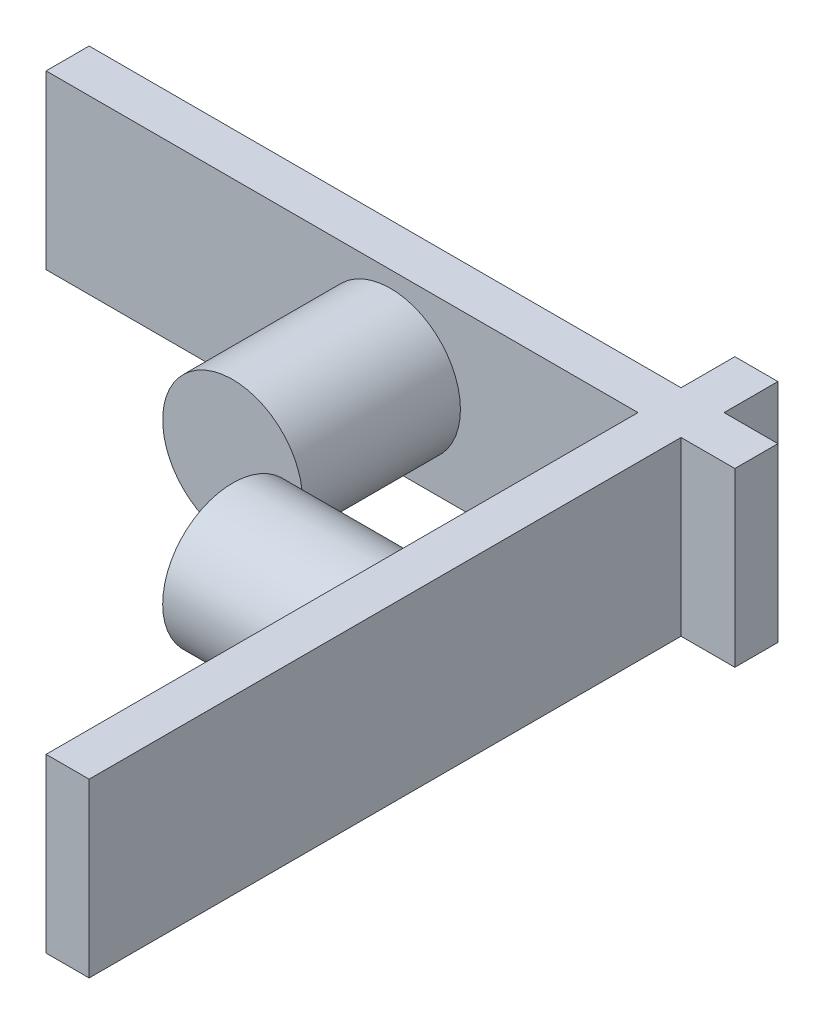
ISO-10303-21;
HEADER;
FILE_DESCRIPTION(('STEP AP214'),'2;1');
FILE_NAME('part.step','',(''),(''),'','','');
FILE_SCHEMA(('AUTOMOTIVE_DESIGN { 1 0 10303 214 1 1 1 1 }'));
ENDSEC;
DATA;
#1=APPLICATION_CONTEXT('core data for automotive mechanical design processes');
#2=APPLICATION_PROTOCOL_DEFINITION('international standard','automotive_design',2000,#1);
#3=PRODUCT_CONTEXT('',#1,'mechanical');
#4=PRODUCT('Part','Part','',(#3));
#5=PRODUCT_RELATED_PRODUCT_CATEGORY('part','',(#4));
#6=PRODUCT_DEFINITION_FORMATION('','',#4);
#7=PRODUCT_DEFINITION_CONTEXT('part definition',#1,'design');
#8=PRODUCT_DEFINITION('design','',#6,#7);
#9=PRODUCT_DEFINITION_SHAPE('','',#8);
#10=(LENGTH_UNIT() NAMED_UNIT(*) SI_UNIT(.MILLI.,.METRE.));
#11=(NAMED_UNIT(*) PLANE_ANGLE_UNIT() SI_UNIT($,.RADIAN.));
#12=(NAMED_UNIT(*) SI_UNIT($,.STERADIAN.) SOLID_ANGLE_UNIT());
#13=UNCERTAINTY_MEASURE_WITH_UNIT(LENGTH_MEASURE(1.E-05),#10,'distance_accuracy_value','');
#14=(GEOMETRIC_REPRESENTATION_CONTEXT(3) GLOBAL_UNCERTAINTY_ASSIGNED_CONTEXT((#13)) GLOBAL_UNIT_ASSIGNED_CONTEXT((#10,
#11,#12)) REPRESENTATION_CONTEXT('',''));
#15=CARTESIAN_POINT('',(0.,0.,0.));
#16=DIRECTION('',(0.,0.,1.));
#17=DIRECTION('',(1.,0.,0.));
#18=AXIS2_PLACEMENT_3D('',#15,#16,#17);
#19=CARTESIAN_POINT('',(0.,0.,-3.));
#20=DIRECTION('',(0.,0.,1.));
#21=DIRECTION('',(1.,0.,0.));
#22=AXIS2_PLACEMENT_3D('',#19,#20,#21);
#23=PLANE('',#22);
#24=DIRECTION('',(0.,-1.,0.));
#25=VECTOR('',#24,1.);
#26=CARTESIAN_POINT('',(20.2500000000001,0.,-3.));
#27=LINE('',#26,#25);
#28=CARTESIAN_POINT('',(20.2500000000001,6.,-3.));
#29=VERTEX_POINT('',#28);
#30=CARTESIAN_POINT('',(20.2500000000001,-6.,-3.));
#31=VERTEX_POINT('',#30);
#32=EDGE_CURVE('E154',#29,#31,#27,.T.);
#33=ORIENTED_EDGE('',*,*,#32,.F.);
#34=DIRECTION('',(1.,0.,0.));
#35=VECTOR('',#34,1.);
#36=CARTESIAN_POINT('',(0.,6.,-3.));
#37=LINE('',#36,#35);
#38=CARTESIAN_POINT('',(24.,6.,-3.));
#39=VERTEX_POINT('',#38);
#40=EDGE_CURVE('E228',#29,#39,#37,.T.);
#41=ORIENTED_EDGE('',*,*,#40,.T.);
#42=DIRECTION('',(0.,-1.,0.));
#43=VECTOR('',#42,1.);
#44=CARTESIAN_POINT('',(24.,0.,-3.));
#45=LINE('',#44,#43);
#46=CARTESIAN_POINT('',(24.,-6.,-3.));
#47=VERTEX_POINT('',#46);
#48=EDGE_CURVE('E224',#39,#47,#45,.T.);
#49=ORIENTED_EDGE('',*,*,#48,.T.);
#50=DIRECTION('',(1.,0.,0.));
#51=VECTOR('',#50,1.);
#52=CARTESIAN_POINT('',(0.,-6.,-3.));
#53=LINE('',#52,#51);
#54=EDGE_CURVE('E219',#31,#47,#53,.T.);
#55=ORIENTED_EDGE('',*,*,#54,.F.);
#56=EDGE_LOOP('',(#33,#41,#49,#55));
#57=FACE_BOUND('',#56,.T.);
#58=ADVANCED_FACE('F47',(#57),#23,.F.);
#59=CARTESIAN_POINT('',(0.,0.,0.));
#60=DIRECTION('',(0.,0.,1.));
#61=DIRECTION('',(1.,0.,0.));
#62=AXIS2_PLACEMENT_3D('',#59,#60,#61);
#63=PLANE('',#62);
#64=DIRECTION('',(1.,0.,0.));
#65=VECTOR('',#64,1.);
#66=CARTESIAN_POINT('',(0.,6.,0.));
#67=LINE('',#66,#65);
#68=CARTESIAN_POINT('',(20.2500000000001,6.,0.));
#69=VERTEX_POINT('',#68);
#70=CARTESIAN_POINT('',(24.,6.,0.));
#71=VERTEX_POINT('',#70);
#72=EDGE_CURVE('E70',#69,#71,#67,.T.);
#73=ORIENTED_EDGE('',*,*,#72,.F.);
#74=DIRECTION('',(0.,-1.,0.));
#75=VECTOR('',#74,1.);
#76=CARTESIAN_POINT('',(20.2500000000001,0.,0.));
#77=LINE('',#76,#75);
#78=CARTESIAN_POINT('',(20.2500000000001,-6.,0.));
#79=VERTEX_POINT('',#78);
#80=EDGE_CURVE('E11',#69,#79,#77,.T.);
#81=ORIENTED_EDGE('',*,*,#80,.T.);
#82=DIRECTION('',(1.,0.,0.));
#83=VECTOR('',#82,1.);
#84=CARTESIAN_POINT('',(0.,-6.,0.));
#85=LINE('',#84,#83);
#86=CARTESIAN_POINT('',(24.,-6.,0.));
#87=VERTEX_POINT('',#86);
#88=EDGE_CURVE('E237',#79,#87,#85,.T.);
#89=ORIENTED_EDGE('',*,*,#88,.T.);
#90=DIRECTION('',(0.,-1.,0.));
#91=VECTOR('',#90,1.);
#92=CARTESIAN_POINT('',(24.,0.,0.));
#93=LINE('',#92,#91);
#94=EDGE_CURVE('E241',#71,#87,#93,.T.);
#95=ORIENTED_EDGE('',*,*,#94,.F.);
#96=EDGE_LOOP('',(#73,#81,#89,#95));
#97=FACE_BOUND('',#96,.T.);
#98=ADVANCED_FACE('F293',(#97),#63,.T.);
#99=CARTESIAN_POINT('',(-24.,0.,-3.));
#100=DIRECTION('',(-1.,0.,0.));
#101=DIRECTION('',(0.,0.,1.));
#102=AXIS2_PLACEMENT_3D('',#99,#100,#101);
#103=PLANE('',#102);
#104=DIRECTION('',(0.,-1.,0.));
#105=VECTOR('',#104,1.);
#106=CARTESIAN_POINT('',(-24.,0.,0.));
#107=LINE('',#106,#105);
#108=CARTESIAN_POINT('',(-24.,6.,0.));
#109=VERTEX_POINT('',#108);
#110=CARTESIAN_POINT('',(-24.,-6.,0.));
#111=VERTEX_POINT('',#110);
#112=EDGE_CURVE('E209',#109,#111,#107,.T.);
#113=ORIENTED_EDGE('',*,*,#112,.F.);
#114=DIRECTION('',(0.,0.,1.));
#115=VECTOR('',#114,1.);
#116=CARTESIAN_POINT('',(-24.,6.,-3.));
#117=LINE('',#116,#115);
#118=CARTESIAN_POINT('',(-24.,6.,-3.));
#119=VERTEX_POINT('',#118);
#120=EDGE_CURVE('E214',#119,#109,#117,.T.);
#121=ORIENTED_EDGE('',*,*,#120,.F.);
#122=DIRECTION('',(0.,-1.,0.));
#123=VECTOR('',#122,1.);
#124=CARTESIAN_POINT('',(-24.,0.,-3.));
#125=LINE('',#124,#123);
#126=CARTESIAN_POINT('',(-24.,-6.,-3.));
#127=VERTEX_POINT('',#126);
#128=EDGE_CURVE('E215',#119,#127,#125,.T.);
#129=ORIENTED_EDGE('',*,*,#128,.T.);
#130=DIRECTION('',(0.,0.,1.));
#131=VECTOR('',#130,1.);
#132=CARTESIAN_POINT('',(-24.,-6.,-3.));
#133=LINE('',#132,#131);
#134=EDGE_CURVE('E233',#127,#111,#133,.T.);
#135=ORIENTED_EDGE('',*,*,#134,.T.);
#136=EDGE_LOOP('',(#113,#121,#129,#135));
#137=FACE_BOUND('',#136,.T.);
#138=ADVANCED_FACE('F49',(#137),#103,.T.);
#139=CARTESIAN_POINT('',(0.,6.,-3.));
#140=DIRECTION('',(0.,-1.,0.));
#141=DIRECTION('',(0.,0.,-1.));
#142=AXIS2_PLACEMENT_3D('',#139,#140,#141);
#143=PLANE('',#142);
#144=CARTESIAN_POINT('',(17.2500000000001,6.,0.));
#145=VERTEX_POINT('',#144);
#146=EDGE_CURVE('E220',#109,#145,#67,.T.);
#147=ORIENTED_EDGE('',*,*,#146,.T.);
#148=DIRECTION('',(0.,0.,1.));
#149=VECTOR('',#148,1.);
#150=CARTESIAN_POINT('',(17.25,6.,17.2500000000001));
#151=LINE('',#150,#149);
#152=CARTESIAN_POINT('',(17.2499999999999,6.,41.2500000000001));
#153=VERTEX_POINT('',#152);
#154=EDGE_CURVE('E168',#145,#153,#151,.T.);
#155=ORIENTED_EDGE('',*,*,#154,.T.);
#156=DIRECTION('',(-1.,0.,0.));
#157=VECTOR('',#156,1.);
#158=CARTESIAN_POINT('',(20.2499999999999,6.,41.2500000000001));
#159=LINE('',#158,#157);
#160=CARTESIAN_POINT('',(20.2499999999999,6.,41.2500000000001));
#161=VERTEX_POINT('',#160);
#162=EDGE_CURVE('E194',#161,#153,#159,.T.);
#163=ORIENTED_EDGE('',*,*,#162,.F.);
#164=DIRECTION('',(0.,0.,1.));
#165=VECTOR('',#164,1.);
#166=CARTESIAN_POINT('',(20.25,6.,17.2500000000001));
#167=LINE('',#166,#165);
#168=EDGE_CURVE('E177',#69,#161,#167,.T.);
#169=ORIENTED_EDGE('',*,*,#168,.F.);
#170=ORIENTED_EDGE('',*,*,#72,.T.);
#171=DIRECTION('',(0.,0.,1.));
#172=VECTOR('',#171,1.);
#173=CARTESIAN_POINT('',(24.,6.,-3.));
#174=LINE('',#173,#172);
#175=EDGE_CURVE('E250',#39,#71,#174,.T.);
#176=ORIENTED_EDGE('',*,*,#175,.F.);
#177=ORIENTED_EDGE('',*,*,#40,.F.);
#178=CARTESIAN_POINT('',(20.2500000000001,6.,-6.74999999999993));
#179=VERTEX_POINT('',#178);
#180=EDGE_CURVE('E147',#179,#29,#167,.T.);
#181=ORIENTED_EDGE('',*,*,#180,.F.);
#182=DIRECTION('',(-1.,0.,0.));
#183=VECTOR('',#182,1.);
#184=CARTESIAN_POINT('',(20.2500000000001,6.,-6.74999999999993));
#185=LINE('',#184,#183);
#186=CARTESIAN_POINT('',(17.2500000000001,6.,-6.74999999999994));
#187=VERTEX_POINT('',#186);
#188=EDGE_CURVE('E160',#179,#187,#185,.T.);
#189=ORIENTED_EDGE('',*,*,#188,.T.);
#190=CARTESIAN_POINT('',(17.2500000000001,6.,-3.));
#191=VERTEX_POINT('',#190);
#192=EDGE_CURVE('E163',#187,#191,#151,.T.);
#193=ORIENTED_EDGE('',*,*,#192,.T.);
#194=EDGE_CURVE('E229',#119,#191,#37,.T.);
#195=ORIENTED_EDGE('',*,*,#194,.F.);
#196=ORIENTED_EDGE('',*,*,#120,.T.);
#197=EDGE_LOOP('',(#147,#155,#163,#169,#170,#176,#177,#181,#189,#193,#195,#196));
#198=FACE_BOUND('',#197,.T.);
#199=ADVANCED_FACE('F316',(#198),#143,.F.);
#200=CARTESIAN_POINT('',(24.,0.,-3.));
#201=DIRECTION('',(-1.,0.,0.));
#202=DIRECTION('',(0.,0.,1.));
#203=AXIS2_PLACEMENT_3D('',#200,#201,#202);
#204=PLANE('',#203);
#205=ORIENTED_EDGE('',*,*,#94,.T.);
#206=DIRECTION('',(0.,0.,1.));
#207=VECTOR('',#206,1.);
#208=CARTESIAN_POINT('',(24.,-6.,-3.));
#209=LINE('',#208,#207);
#210=EDGE_CURVE('E254',#47,#87,#209,.T.);
#211=ORIENTED_EDGE('',*,*,#210,.F.);
#212=ORIENTED_EDGE('',*,*,#48,.F.);
#213=ORIENTED_EDGE('',*,*,#175,.T.);
#214=EDGE_LOOP('',(#205,#211,#212,#213));
#215=FACE_BOUND('',#214,.T.);
#216=ADVANCED_FACE('F311',(#215),#204,.F.);
#217=CARTESIAN_POINT('',(0.,-6.,-3.));
#218=DIRECTION('',(0.,-1.,0.));
#219=DIRECTION('',(1.,0.,0.));
#220=AXIS2_PLACEMENT_3D('',#217,#218,#219);
#221=PLANE('',#220);
#222=CARTESIAN_POINT('',(17.2500000000001,-6.,-3.));
#223=VERTEX_POINT('',#222);
#224=EDGE_CURVE('E221',#127,#223,#53,.T.);
#225=ORIENTED_EDGE('',*,*,#224,.T.);
#226=DIRECTION('',(0.,0.,1.));
#227=VECTOR('',#226,1.);
#228=CARTESIAN_POINT('',(17.25,-6.,17.2500000000001));
#229=LINE('',#228,#227);
#230=CARTESIAN_POINT('',(17.2500000000001,-6.,-6.74999999999994));
#231=VERTEX_POINT('',#230);
#232=EDGE_CURVE('E63',#231,#223,#229,.T.);
#233=ORIENTED_EDGE('',*,*,#232,.F.);
#234=DIRECTION('',(-1.,0.,0.));
#235=VECTOR('',#234,1.);
#236=CARTESIAN_POINT('',(20.2500000000001,-6.,-6.74999999999993));
#237=LINE('',#236,#235);
#238=CARTESIAN_POINT('',(20.2500000000001,-6.,-6.74999999999993));
#239=VERTEX_POINT('',#238);
#240=EDGE_CURVE('E136',#239,#231,#237,.T.);
#241=ORIENTED_EDGE('',*,*,#240,.F.);
#242=DIRECTION('',(0.,0.,1.));
#243=VECTOR('',#242,1.);
#244=CARTESIAN_POINT('',(20.25,-6.,17.2500000000001));
#245=LINE('',#244,#243);
#246=EDGE_CURVE('E140',#239,#31,#245,.T.);
#247=ORIENTED_EDGE('',*,*,#246,.T.);
#248=ORIENTED_EDGE('',*,*,#54,.T.);
#249=ORIENTED_EDGE('',*,*,#210,.T.);
#250=ORIENTED_EDGE('',*,*,#88,.F.);
#251=CARTESIAN_POINT('',(20.2499999999999,-6.,41.2500000000001));
#252=VERTEX_POINT('',#251);
#253=EDGE_CURVE('E157',#79,#252,#245,.T.);
#254=ORIENTED_EDGE('',*,*,#253,.T.);
#255=DIRECTION('',(-1.,0.,0.));
#256=VECTOR('',#255,1.);
#257=CARTESIAN_POINT('',(20.2499999999999,-6.,41.2500000000001));
#258=LINE('',#257,#256);
#259=CARTESIAN_POINT('',(17.2499999999999,-6.,41.2500000000001));
#260=VERTEX_POINT('',#259);
#261=EDGE_CURVE('E146',#252,#260,#258,.T.);
#262=ORIENTED_EDGE('',*,*,#261,.T.);
#263=CARTESIAN_POINT('',(17.2500000000001,-6.,0.));
#264=VERTEX_POINT('',#263);
#265=EDGE_CURVE('E183',#264,#260,#229,.T.);
#266=ORIENTED_EDGE('',*,*,#265,.F.);
#267=EDGE_CURVE('E238',#111,#264,#85,.T.);
#268=ORIENTED_EDGE('',*,*,#267,.F.);
#269=ORIENTED_EDGE('',*,*,#134,.F.);
#270=EDGE_LOOP('',(#225,#233,#241,#247,#248,#249,#250,#254,#262,#266,#268,#269));
#271=FACE_BOUND('',#270,.T.);
#272=ADVANCED_FACE('F139',(#271),#221,.T.);
#273=ORIENTED_EDGE('',*,*,#194,.T.);
#274=DIRECTION('',(0.,-1.,0.));
#275=VECTOR('',#274,1.);
#276=CARTESIAN_POINT('',(17.2500000000001,0.,-3.));
#277=LINE('',#276,#275);
#278=EDGE_CURVE('E193',#191,#223,#277,.T.);
#279=ORIENTED_EDGE('',*,*,#278,.T.);
#280=ORIENTED_EDGE('',*,*,#224,.F.);
#281=ORIENTED_EDGE('',*,*,#128,.F.);
#282=EDGE_LOOP('',(#273,#279,#280,#281));
#283=FACE_BOUND('',#282,.T.);
#284=ADVANCED_FACE('F296',(#283),#23,.F.);
#285=DIRECTION('',(0.,-1.,0.));
#286=VECTOR('',#285,1.);
#287=CARTESIAN_POINT('',(17.2500000000001,0.,0.));
#288=LINE('',#287,#286);
#289=EDGE_CURVE('E56',#145,#264,#288,.T.);
#290=ORIENTED_EDGE('',*,*,#289,.F.);
#291=ORIENTED_EDGE('',*,*,#146,.F.);
#292=ORIENTED_EDGE('',*,*,#112,.T.);
#293=ORIENTED_EDGE('',*,*,#267,.T.);
#294=EDGE_LOOP('',(#290,#291,#292,#293));
#295=FACE_BOUND('',#294,.T.);
#296=CARTESIAN_POINT('',(0.,0.,0.));
#297=DIRECTION('',(0.,0.,1.));
#298=DIRECTION('',(1.,0.,0.));
#299=AXIS2_PLACEMENT_3D('',#296,#297,#298);
#300=CIRCLE('',#299,4.875);
#301=CARTESIAN_POINT('',(4.875,0.,0.));
#302=VERTEX_POINT('',#301);
#303=EDGE_CURVE('E210',#302,#302,#300,.T.);
#304=ORIENTED_EDGE('',*,*,#303,.F.);
#305=EDGE_LOOP('',(#304));
#306=FACE_BOUND('',#305,.T.);
#307=ADVANCED_FACE('F302',(#295,#306),#63,.T.);
#308=CARTESIAN_POINT('',(0.,0.,11.));
#309=DIRECTION('',(0.,0.,-1.));
#310=DIRECTION('',(-1.,0.,0.));
#311=AXIS2_PLACEMENT_3D('',#308,#309,#310);
#312=CYLINDRICAL_SURFACE('',#311,4.875);
#313=CARTESIAN_POINT('',(0.,0.,11.));
#314=DIRECTION('',(0.,0.,1.));
#315=DIRECTION('',(1.,0.,0.));
#316=AXIS2_PLACEMENT_3D('',#313,#314,#315);
#317=CIRCLE('',#316,4.875);
#318=CARTESIAN_POINT('',(4.875,0.,11.));
#319=VERTEX_POINT('',#318);
#320=EDGE_CURVE('E205',#319,#319,#317,.T.);
#321=ORIENTED_EDGE('',*,*,#320,.F.);
#322=EDGE_LOOP('',(#321));
#323=FACE_BOUND('',#322,.T.);
#324=ORIENTED_EDGE('',*,*,#303,.T.);
#325=EDGE_LOOP('',(#324));
#326=FACE_BOUND('',#325,.T.);
#327=ADVANCED_FACE('F310',(#323,#326),#312,.T.);
#328=CARTESIAN_POINT('',(0.,0.,11.));
#329=DIRECTION('',(0.,0.,1.));
#330=DIRECTION('',(1.,0.,0.));
#331=AXIS2_PLACEMENT_3D('',#328,#329,#330);
#332=PLANE('',#331);
#333=ORIENTED_EDGE('',*,*,#320,.T.);
#334=EDGE_LOOP('',(#333));
#335=FACE_BOUND('',#334,.T.);
#336=ADVANCED_FACE('F332',(#335),#332,.T.);
#337=CARTESIAN_POINT('',(20.2499999999999,0.,41.2500000000001));
#338=DIRECTION('',(0.,0.,-1.));
#339=DIRECTION('',(-1.,0.,0.));
#340=AXIS2_PLACEMENT_3D('',#337,#338,#339);
#341=PLANE('',#340);
#342=DIRECTION('',(0.,-1.,0.));
#343=VECTOR('',#342,1.);
#344=CARTESIAN_POINT('',(17.2499999999999,0.,41.2500000000001));
#345=LINE('',#344,#343);
#346=EDGE_CURVE('E187',#153,#260,#345,.T.);
#347=ORIENTED_EDGE('',*,*,#346,.T.);
#348=ORIENTED_EDGE('',*,*,#261,.F.);
#349=DIRECTION('',(0.,-1.,0.));
#350=VECTOR('',#349,1.);
#351=CARTESIAN_POINT('',(20.2499999999999,0.,41.2500000000001));
#352=LINE('',#351,#350);
#353=EDGE_CURVE('E156',#161,#252,#352,.T.);
#354=ORIENTED_EDGE('',*,*,#353,.F.);
#355=ORIENTED_EDGE('',*,*,#162,.T.);
#356=EDGE_LOOP('',(#347,#348,#354,#355));
#357=FACE_BOUND('',#356,.T.);
#358=ADVANCED_FACE('F288',(#357),#341,.F.);
#359=CARTESIAN_POINT('',(20.25,0.,17.2500000000001));
#360=DIRECTION('',(-1.,0.,0.));
#361=DIRECTION('',(0.,0.,1.));
#362=AXIS2_PLACEMENT_3D('',#359,#360,#361);
#363=PLANE('',#362);
#364=ORIENTED_EDGE('',*,*,#80,.F.);
#365=ORIENTED_EDGE('',*,*,#168,.T.);
#366=ORIENTED_EDGE('',*,*,#353,.T.);
#367=ORIENTED_EDGE('',*,*,#253,.F.);
#368=EDGE_LOOP('',(#364,#365,#366,#367));
#369=FACE_BOUND('',#368,.T.);
#370=ADVANCED_FACE('F280',(#369),#363,.F.);
#371=CARTESIAN_POINT('',(17.25,0.,17.2500000000001));
#372=DIRECTION('',(-1.,0.,0.));
#373=DIRECTION('',(0.,0.,1.));
#374=AXIS2_PLACEMENT_3D('',#371,#372,#373);
#375=PLANE('',#374);
#376=CARTESIAN_POINT('',(17.25,0.,17.2500000000001));
#377=DIRECTION('',(-1.,0.,0.));
#378=DIRECTION('',(0.,0.,1.));
#379=AXIS2_PLACEMENT_3D('',#376,#377,#378);
#380=CIRCLE('',#379,4.875);
#381=CARTESIAN_POINT('',(17.25,0.,22.1250000000001));
#382=VERTEX_POINT('',#381);
#383=EDGE_CURVE('E171',#382,#382,#380,.T.);
#384=ORIENTED_EDGE('',*,*,#383,.F.);
#385=EDGE_LOOP('',(#384));
#386=FACE_BOUND('',#385,.T.);
#387=ORIENTED_EDGE('',*,*,#154,.F.);
#388=ORIENTED_EDGE('',*,*,#289,.T.);
#389=ORIENTED_EDGE('',*,*,#265,.T.);
#390=ORIENTED_EDGE('',*,*,#346,.F.);
#391=EDGE_LOOP('',(#387,#388,#389,#390));
#392=FACE_BOUND('',#391,.T.);
#393=ADVANCED_FACE('F264',(#386,#392),#375,.T.);
#394=ORIENTED_EDGE('',*,*,#180,.T.);
#395=ORIENTED_EDGE('',*,*,#32,.T.);
#396=ORIENTED_EDGE('',*,*,#246,.F.);
#397=DIRECTION('',(0.,-1.,0.));
#398=VECTOR('',#397,1.);
#399=CARTESIAN_POINT('',(20.2500000000001,0.,-6.74999999999993));
#400=LINE('',#399,#398);
#401=EDGE_CURVE('E152',#179,#239,#400,.T.);
#402=ORIENTED_EDGE('',*,*,#401,.F.);
#403=EDGE_LOOP('',(#394,#395,#396,#402));
#404=FACE_BOUND('',#403,.T.);
#405=ADVANCED_FACE('F151',(#404),#363,.F.);
#406=ORIENTED_EDGE('',*,*,#278,.F.);
#407=ORIENTED_EDGE('',*,*,#192,.F.);
#408=DIRECTION('',(0.,-1.,0.));
#409=VECTOR('',#408,1.);
#410=CARTESIAN_POINT('',(17.2500000000001,0.,-6.74999999999994));
#411=LINE('',#410,#409);
#412=EDGE_CURVE('E180',#187,#231,#411,.T.);
#413=ORIENTED_EDGE('',*,*,#412,.T.);
#414=ORIENTED_EDGE('',*,*,#232,.T.);
#415=EDGE_LOOP('',(#406,#407,#413,#414));
#416=FACE_BOUND('',#415,.T.);
#417=ADVANCED_FACE('F282',(#416),#375,.T.);
#418=CARTESIAN_POINT('',(20.2500000000001,0.,-6.74999999999993));
#419=DIRECTION('',(0.,0.,-1.));
#420=DIRECTION('',(-1.,0.,0.));
#421=AXIS2_PLACEMENT_3D('',#418,#419,#420);
#422=PLANE('',#421);
#423=ORIENTED_EDGE('',*,*,#412,.F.);
#424=ORIENTED_EDGE('',*,*,#188,.F.);
#425=ORIENTED_EDGE('',*,*,#401,.T.);
#426=ORIENTED_EDGE('',*,*,#240,.T.);
#427=EDGE_LOOP('',(#423,#424,#425,#426));
#428=FACE_BOUND('',#427,.T.);
#429=ADVANCED_FACE('F159',(#428),#422,.T.);
#430=CARTESIAN_POINT('',(6.25,0.,17.25));
#431=DIRECTION('',(1.,0.,0.));
#432=DIRECTION('',(0.,0.,-1.));
#433=AXIS2_PLACEMENT_3D('',#430,#431,#432);
#434=CYLINDRICAL_SURFACE('',#433,4.875);
#435=CARTESIAN_POINT('',(6.25,0.,17.25));
#436=DIRECTION('',(-1.,0.,0.));
#437=DIRECTION('',(0.,0.,1.));
#438=AXIS2_PLACEMENT_3D('',#435,#436,#437);
#439=CIRCLE('',#438,4.875);
#440=CARTESIAN_POINT('',(6.24999999999998,0.,22.125));
#441=VERTEX_POINT('',#440);
#442=EDGE_CURVE('E184',#441,#441,#439,.T.);
#443=ORIENTED_EDGE('',*,*,#442,.F.);
#444=EDGE_LOOP('',(#443));
#445=FACE_BOUND('',#444,.T.);
#446=ORIENTED_EDGE('',*,*,#383,.T.);
#447=EDGE_LOOP('',(#446));
#448=FACE_BOUND('',#447,.T.);
#449=ADVANCED_FACE('F277',(#445,#448),#434,.T.);
#450=CARTESIAN_POINT('',(6.25,0.,17.25));
#451=DIRECTION('',(-1.,0.,0.));
#452=DIRECTION('',(0.,0.,1.));
#453=AXIS2_PLACEMENT_3D('',#450,#451,#452);
#454=PLANE('',#453);
#455=ORIENTED_EDGE('',*,*,#442,.T.);
#456=EDGE_LOOP('',(#455));
#457=FACE_BOUND('',#456,.T.);
#458=ADVANCED_FACE('F515',(#457),#454,.T.);
#459=CLOSED_SHELL('',(#58,#98,#138,#199,#216,#272,#284,#307,#327,#336,#358,#370,#393,#405,#417,
#429,#449,#458));
#460=MANIFOLD_SOLID_BREP('B2',#459);
#461=ADVANCED_BREP_SHAPE_REPRESENTATION('',(#18,#460),#14);
#462=SHAPE_DEFINITION_REPRESENTATION(#9,#461);
ENDSEC;
END-ISO-10303-21;
